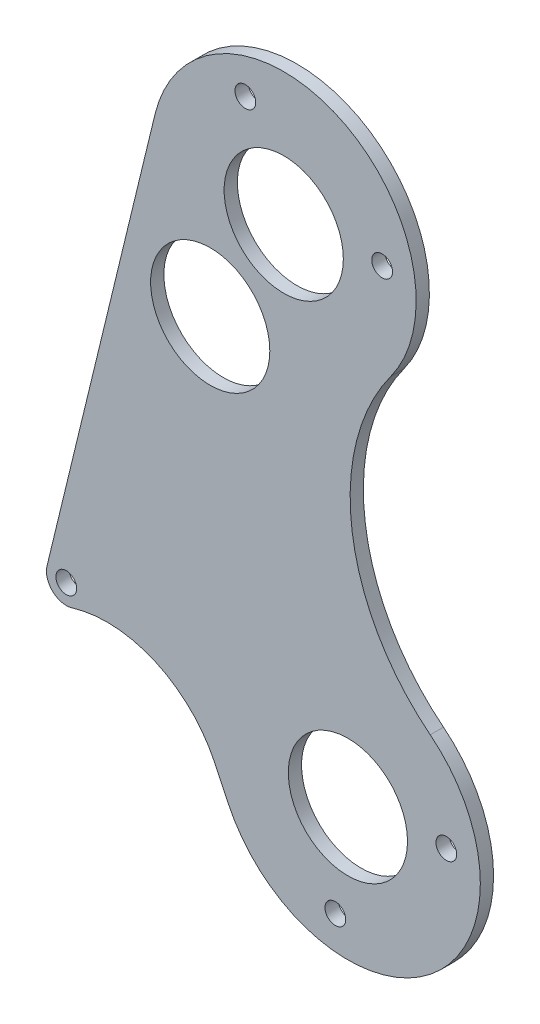
ISO-10303-21;
HEADER;
FILE_DESCRIPTION(('STEP AP214'),'2;1');
FILE_NAME('part.step','',(''),(''),'','','');
FILE_SCHEMA(('AUTOMOTIVE_DESIGN { 1 0 10303 214 1 1 1 1 }'));
ENDSEC;
DATA;
#1=APPLICATION_CONTEXT('core data for automotive mechanical design processes');
#2=APPLICATION_PROTOCOL_DEFINITION('international standard','automotive_design',2000,#1);
#3=PRODUCT_CONTEXT('',#1,'mechanical');
#4=PRODUCT('Part','Part','',(#3));
#5=PRODUCT_RELATED_PRODUCT_CATEGORY('part','',(#4));
#6=PRODUCT_DEFINITION_FORMATION('','',#4);
#7=PRODUCT_DEFINITION_CONTEXT('part definition',#1,'design');
#8=PRODUCT_DEFINITION('design','',#6,#7);
#9=PRODUCT_DEFINITION_SHAPE('','',#8);
#10=(LENGTH_UNIT() NAMED_UNIT(*) SI_UNIT(.MILLI.,.METRE.));
#11=(NAMED_UNIT(*) PLANE_ANGLE_UNIT() SI_UNIT($,.RADIAN.));
#12=(NAMED_UNIT(*) SI_UNIT($,.STERADIAN.) SOLID_ANGLE_UNIT());
#13=UNCERTAINTY_MEASURE_WITH_UNIT(LENGTH_MEASURE(1.E-05),#10,'distance_accuracy_value','');
#14=(GEOMETRIC_REPRESENTATION_CONTEXT(3) GLOBAL_UNCERTAINTY_ASSIGNED_CONTEXT((#13)) GLOBAL_UNIT_ASSIGNED_CONTEXT((#10,
#11,#12)) REPRESENTATION_CONTEXT('',''));
#15=CARTESIAN_POINT('',(0.,0.,0.));
#16=DIRECTION('',(0.,0.,1.));
#17=DIRECTION('',(1.,0.,0.));
#18=AXIS2_PLACEMENT_3D('',#15,#16,#17);
#19=CARTESIAN_POINT('',(705.932956494156,300.505165485995,1.5875));
#20=DIRECTION('',(0.,0.,1.));
#21=DIRECTION('',(1.,0.,0.));
#22=AXIS2_PLACEMENT_3D('',#19,#20,#21);
#23=PLANE('',#22);
#24=CARTESIAN_POINT('',(587.084023474299,248.692957946112,1.5875));
#25=DIRECTION('',(0.,0.,1.));
#26=DIRECTION('',(1.,0.,0.));
#27=AXIS2_PLACEMENT_3D('',#24,#25,#26);
#28=CIRCLE('',#27,2.48920000000018);
#29=CARTESIAN_POINT('',(589.5732234743,248.692957946112,1.5875));
#30=VERTEX_POINT('',#29);
#31=EDGE_CURVE('E198',#30,#30,#28,.T.);
#32=ORIENTED_EDGE('',*,*,#31,.F.);
#33=EDGE_LOOP('',(#32));
#34=FACE_BOUND('',#33,.T.);
#35=CARTESIAN_POINT('',(639.214570258484,349.117503818025,1.5875));
#36=DIRECTION('',(0.,0.,1.));
#37=DIRECTION('',(1.,0.,0.));
#38=AXIS2_PLACEMENT_3D('',#35,#36,#37);
#39=CIRCLE('',#38,14.2875);
#40=CARTESIAN_POINT('',(653.502070258484,349.117503818025,1.5875));
#41=VERTEX_POINT('',#40);
#42=EDGE_CURVE('E186',#41,#41,#39,.T.);
#43=ORIENTED_EDGE('',*,*,#42,.F.);
#44=EDGE_LOOP('',(#43));
#45=FACE_BOUND('',#44,.T.);
#46=CARTESIAN_POINT('',(662.810390943274,352.322562703799,1.5875));
#47=DIRECTION('',(0.,0.,1.));
#48=DIRECTION('',(1.,0.,0.));
#49=AXIS2_PLACEMENT_3D('',#46,#47,#48);
#50=CIRCLE('',#49,2.48919999999995);
#51=CARTESIAN_POINT('',(665.299590943274,352.322562703799,1.5875));
#52=VERTEX_POINT('',#51);
#53=EDGE_CURVE('E174',#52,#52,#50,.T.);
#54=ORIENTED_EDGE('',*,*,#53,.F.);
#55=EDGE_LOOP('',(#54));
#56=FACE_BOUND('',#55,.T.);
#57=CARTESIAN_POINT('',(678.194673594987,239.062623416811,1.5875));
#58=DIRECTION('',(0.,0.,1.));
#59=DIRECTION('',(1.,0.,0.));
#60=AXIS2_PLACEMENT_3D('',#57,#58,#59);
#61=CIRCLE('',#60,2.48919999999995);
#62=CARTESIAN_POINT('',(680.683873594987,239.062623416811,1.5875));
#63=VERTEX_POINT('',#62);
#64=EDGE_CURVE('E132',#63,#63,#61,.T.);
#65=ORIENTED_EDGE('',*,*,#64,.F.);
#66=EDGE_LOOP('',(#65));
#67=FACE_BOUND('',#66,.T.);
#68=CARTESIAN_POINT('',(705.932956494156,300.505165485995,1.5875));
#69=DIRECTION('',(0.,0.,-1.));
#70=DIRECTION('',(1.,0.,0.));
#71=AXIS2_PLACEMENT_3D('',#68,#69,#70);
#72=CIRCLE('',#71,50.8);
#73=CARTESIAN_POINT('',(674.342738904028,260.72202643679,1.5875));
#74=VERTEX_POINT('',#73);
#75=CARTESIAN_POINT('',(664.875488041435,330.420450613398,1.5875));
#76=VERTEX_POINT('',#75);
#77=EDGE_CURVE('E141',#74,#76,#72,.T.);
#78=ORIENTED_EDGE('',*,*,#77,.T.);
#79=CARTESIAN_POINT('',(639.214570258484,349.117503818025,1.5875));
#80=DIRECTION('',(0.,0.,1.));
#81=DIRECTION('',(-1.,0.,0.));
#82=AXIS2_PLACEMENT_3D('',#79,#80,#81);
#83=CIRCLE('',#82,31.75);
#84=CARTESIAN_POINT('',(608.35938841906,356.602171723553,1.5875));
#85=VERTEX_POINT('',#84);
#86=EDGE_CURVE('E94',#76,#85,#83,.T.);
#87=ORIENTED_EDGE('',*,*,#86,.T.);
#88=DIRECTION('',(-0.235737571827634,-0.971816750848024,0.));
#89=VECTOR('',#88,1.);
#90=CARTESIAN_POINT('',(582.455746198386,249.815658131941,1.5875));
#91=LINE('',#90,#89);
#92=CARTESIAN_POINT('',(582.455746198386,249.815658131941,1.5875));
#93=VERTEX_POINT('',#92);
#94=EDGE_CURVE('E153',#85,#93,#91,.T.);
#95=ORIENTED_EDGE('',*,*,#94,.T.);
#96=CARTESIAN_POINT('',(587.084023474299,248.692957946112,1.5875));
#97=DIRECTION('',(0.,0.,1.));
#98=DIRECTION('',(1.,0.,0.));
#99=AXIS2_PLACEMENT_3D('',#96,#97,#98);
#100=CIRCLE('',#99,4.76250000000006);
#101=CARTESIAN_POINT('',(588.479947674082,244.139629286938,1.5875));
#102=VERTEX_POINT('',#101);
#103=EDGE_CURVE('E110',#93,#102,#100,.T.);
#104=ORIENTED_EDGE('',*,*,#103,.T.);
#105=CARTESIAN_POINT('',(596.855492872776,216.819657331889,1.5875));
#106=DIRECTION('',(0.,0.,-1.));
#107=DIRECTION('',(1.,0.,0.));
#108=AXIS2_PLACEMENT_3D('',#105,#106,#107);
#109=CIRCLE('',#108,28.575);
#110=CARTESIAN_POINT('',(622.664025284348,229.085474865215,1.5875));
#111=VERTEX_POINT('',#110);
#112=EDGE_CURVE('E104',#102,#111,#109,.T.);
#113=ORIENTED_EDGE('',*,*,#112,.T.);
#114=DIRECTION('',(0.429249957421718,-0.903185736187996,0.));
#115=VECTOR('',#114,1.);
#116=CARTESIAN_POINT('',(625.922705786229,222.228878382898,1.5875));
#117=LINE('',#116,#115);
#118=CARTESIAN_POINT('',(625.922705786229,222.228878382898,1.5875));
#119=VERTEX_POINT('',#118);
#120=EDGE_CURVE('E108',#111,#119,#117,.T.);
#121=ORIENTED_EDGE('',*,*,#120,.T.);
#122=CARTESIAN_POINT('',(654.598852910197,235.857564531037,1.5875));
#123=DIRECTION('',(0.,0.,1.));
#124=DIRECTION('',(-1.,0.,0.));
#125=AXIS2_PLACEMENT_3D('',#122,#123,#124);
#126=CIRCLE('',#125,31.75);
#127=EDGE_CURVE('E54',#119,#74,#126,.T.);
#128=ORIENTED_EDGE('',*,*,#127,.T.);
#129=EDGE_LOOP('',(#78,#87,#95,#104,#113,#121,#128));
#130=FACE_BOUND('',#129,.T.);
#131=CARTESIAN_POINT('',(651.587654284696,212.2362216588,1.5875));
#132=DIRECTION('',(0.,0.,1.));
#133=DIRECTION('',(1.,0.,0.));
#134=AXIS2_PLACEMENT_3D('',#131,#132,#133);
#135=CIRCLE('',#134,2.48920000000041);
#136=CARTESIAN_POINT('',(654.076854284697,212.2362216588,1.5875));
#137=VERTEX_POINT('',#136);
#138=EDGE_CURVE('E168',#137,#137,#135,.T.);
#139=ORIENTED_EDGE('',*,*,#138,.F.);
#140=EDGE_LOOP('',(#139));
#141=FACE_BOUND('',#140,.T.);
#142=CARTESIAN_POINT('',(630.011673327891,371.079786129636,1.5875));
#143=DIRECTION('',(0.,0.,1.));
#144=DIRECTION('',(1.,0.,0.));
#145=AXIS2_PLACEMENT_3D('',#142,#143,#144);
#146=CIRCLE('',#145,2.48919999999995);
#147=CARTESIAN_POINT('',(632.500873327891,371.079786129636,1.5875));
#148=VERTEX_POINT('',#147);
#149=EDGE_CURVE('E180',#148,#148,#146,.T.);
#150=ORIENTED_EDGE('',*,*,#149,.F.);
#151=EDGE_LOOP('',(#150));
#152=FACE_BOUND('',#151,.T.);
#153=CARTESIAN_POINT('',(654.598852910197,235.857564531037,1.5875));
#154=DIRECTION('',(0.,0.,1.));
#155=DIRECTION('',(1.,0.,0.));
#156=AXIS2_PLACEMENT_3D('',#153,#154,#155);
#157=CIRCLE('',#156,14.2875);
#158=CARTESIAN_POINT('',(668.886352910198,235.857564531037,1.5875));
#159=VERTEX_POINT('',#158);
#160=EDGE_CURVE('E192',#159,#159,#157,.T.);
#161=ORIENTED_EDGE('',*,*,#160,.F.);
#162=EDGE_LOOP('',(#161));
#163=FACE_BOUND('',#162,.T.);
#164=CARTESIAN_POINT('',(621.587403634769,321.196124969197,1.5875));
#165=DIRECTION('',(0.,0.,1.));
#166=DIRECTION('',(1.,0.,0.));
#167=AXIS2_PLACEMENT_3D('',#164,#165,#166);
#168=CIRCLE('',#167,14.2875);
#169=CARTESIAN_POINT('',(635.874903634769,321.196124969197,1.5875));
#170=VERTEX_POINT('',#169);
#171=EDGE_CURVE('E204',#170,#170,#168,.T.);
#172=ORIENTED_EDGE('',*,*,#171,.F.);
#173=EDGE_LOOP('',(#172));
#174=FACE_BOUND('',#173,.T.);
#175=ADVANCED_FACE('F37',(#34,#45,#56,#67,#130,#141,#152,#163,#174),#23,.T.);
#176=CARTESIAN_POINT('',(705.932956494156,300.505165485995,-1.5875));
#177=DIRECTION('',(0.,0.,1.));
#178=DIRECTION('',(1.,0.,0.));
#179=AXIS2_PLACEMENT_3D('',#176,#177,#178);
#180=PLANE('',#179);
#181=CARTESIAN_POINT('',(705.932956494156,300.505165485995,-1.5875));
#182=DIRECTION('',(0.,0.,-1.));
#183=DIRECTION('',(1.,0.,0.));
#184=AXIS2_PLACEMENT_3D('',#181,#182,#183);
#185=CIRCLE('',#184,50.8);
#186=CARTESIAN_POINT('',(674.342738904028,260.72202643679,-1.5875));
#187=VERTEX_POINT('',#186);
#188=CARTESIAN_POINT('',(664.875488041435,330.420450613398,-1.5875));
#189=VERTEX_POINT('',#188);
#190=EDGE_CURVE('E128',#187,#189,#185,.T.);
#191=ORIENTED_EDGE('',*,*,#190,.F.);
#192=CARTESIAN_POINT('',(654.598852910197,235.857564531037,-1.5875));
#193=DIRECTION('',(0.,0.,1.));
#194=DIRECTION('',(-1.,0.,0.));
#195=AXIS2_PLACEMENT_3D('',#192,#193,#194);
#196=CIRCLE('',#195,31.75);
#197=CARTESIAN_POINT('',(625.922705786229,222.228878382898,-1.5875));
#198=VERTEX_POINT('',#197);
#199=EDGE_CURVE('E86',#198,#187,#196,.T.);
#200=ORIENTED_EDGE('',*,*,#199,.F.);
#201=DIRECTION('',(0.429249957421718,-0.903185736187996,0.));
#202=VECTOR('',#201,1.);
#203=CARTESIAN_POINT('',(625.922705786229,222.228878382898,-1.5875));
#204=LINE('',#203,#202);
#205=CARTESIAN_POINT('',(622.664025284348,229.085474865215,-1.5875));
#206=VERTEX_POINT('',#205);
#207=EDGE_CURVE('E80',#206,#198,#204,.T.);
#208=ORIENTED_EDGE('',*,*,#207,.F.);
#209=CARTESIAN_POINT('',(596.855492872776,216.819657331889,-1.5875));
#210=DIRECTION('',(0.,0.,-1.));
#211=DIRECTION('',(1.,0.,0.));
#212=AXIS2_PLACEMENT_3D('',#209,#210,#211);
#213=CIRCLE('',#212,28.575);
#214=CARTESIAN_POINT('',(588.479947674082,244.139629286938,-1.5875));
#215=VERTEX_POINT('',#214);
#216=EDGE_CURVE('E118',#215,#206,#213,.T.);
#217=ORIENTED_EDGE('',*,*,#216,.F.);
#218=CARTESIAN_POINT('',(587.084023474299,248.692957946112,-1.5875));
#219=DIRECTION('',(0.,0.,1.));
#220=DIRECTION('',(1.,0.,0.));
#221=AXIS2_PLACEMENT_3D('',#218,#219,#220);
#222=CIRCLE('',#221,4.76250000000006);
#223=CARTESIAN_POINT('',(582.455746198386,249.815658131941,-1.5875));
#224=VERTEX_POINT('',#223);
#225=EDGE_CURVE('E136',#224,#215,#222,.T.);
#226=ORIENTED_EDGE('',*,*,#225,.F.);
#227=DIRECTION('',(-0.235737571827634,-0.971816750848024,0.));
#228=VECTOR('',#227,1.);
#229=CARTESIAN_POINT('',(582.455746198386,249.815658131941,-1.5875));
#230=LINE('',#229,#228);
#231=CARTESIAN_POINT('',(608.35938841906,356.602171723553,-1.5875));
#232=VERTEX_POINT('',#231);
#233=EDGE_CURVE('E134',#232,#224,#230,.T.);
#234=ORIENTED_EDGE('',*,*,#233,.F.);
#235=CARTESIAN_POINT('',(639.214570258484,349.117503818025,-1.5875));
#236=DIRECTION('',(0.,0.,1.));
#237=DIRECTION('',(-1.,0.,0.));
#238=AXIS2_PLACEMENT_3D('',#235,#236,#237);
#239=CIRCLE('',#238,31.75);
#240=EDGE_CURVE('E131',#189,#232,#239,.T.);
#241=ORIENTED_EDGE('',*,*,#240,.F.);
#242=EDGE_LOOP('',(#191,#200,#208,#217,#226,#234,#241));
#243=FACE_BOUND('',#242,.T.);
#244=CARTESIAN_POINT('',(678.194673594987,239.062623416811,-1.5875));
#245=DIRECTION('',(0.,0.,1.));
#246=DIRECTION('',(1.,0.,0.));
#247=AXIS2_PLACEMENT_3D('',#244,#245,#246);
#248=CIRCLE('',#247,2.48919999999995);
#249=CARTESIAN_POINT('',(680.683873594987,239.062623416811,-1.5875));
#250=VERTEX_POINT('',#249);
#251=EDGE_CURVE('E165',#250,#250,#248,.T.);
#252=ORIENTED_EDGE('',*,*,#251,.T.);
#253=EDGE_LOOP('',(#252));
#254=FACE_BOUND('',#253,.T.);
#255=CARTESIAN_POINT('',(651.587654284696,212.2362216588,-1.5875));
#256=DIRECTION('',(0.,0.,1.));
#257=DIRECTION('',(1.,0.,0.));
#258=AXIS2_PLACEMENT_3D('',#255,#256,#257);
#259=CIRCLE('',#258,2.48920000000041);
#260=CARTESIAN_POINT('',(654.076854284697,212.2362216588,-1.5875));
#261=VERTEX_POINT('',#260);
#262=EDGE_CURVE('E171',#261,#261,#259,.T.);
#263=ORIENTED_EDGE('',*,*,#262,.T.);
#264=EDGE_LOOP('',(#263));
#265=FACE_BOUND('',#264,.T.);
#266=CARTESIAN_POINT('',(662.810390943274,352.322562703799,-1.5875));
#267=DIRECTION('',(0.,0.,1.));
#268=DIRECTION('',(1.,0.,0.));
#269=AXIS2_PLACEMENT_3D('',#266,#267,#268);
#270=CIRCLE('',#269,2.48919999999995);
#271=CARTESIAN_POINT('',(665.299590943274,352.322562703799,-1.5875));
#272=VERTEX_POINT('',#271);
#273=EDGE_CURVE('E177',#272,#272,#270,.T.);
#274=ORIENTED_EDGE('',*,*,#273,.T.);
#275=EDGE_LOOP('',(#274));
#276=FACE_BOUND('',#275,.T.);
#277=CARTESIAN_POINT('',(630.011673327891,371.079786129636,-1.5875));
#278=DIRECTION('',(0.,0.,1.));
#279=DIRECTION('',(1.,0.,0.));
#280=AXIS2_PLACEMENT_3D('',#277,#278,#279);
#281=CIRCLE('',#280,2.48919999999995);
#282=CARTESIAN_POINT('',(632.500873327891,371.079786129636,-1.5875));
#283=VERTEX_POINT('',#282);
#284=EDGE_CURVE('E183',#283,#283,#281,.T.);
#285=ORIENTED_EDGE('',*,*,#284,.T.);
#286=EDGE_LOOP('',(#285));
#287=FACE_BOUND('',#286,.T.);
#288=CARTESIAN_POINT('',(639.214570258484,349.117503818025,-1.5875));
#289=DIRECTION('',(0.,0.,1.));
#290=DIRECTION('',(1.,0.,0.));
#291=AXIS2_PLACEMENT_3D('',#288,#289,#290);
#292=CIRCLE('',#291,14.2875);
#293=CARTESIAN_POINT('',(653.502070258484,349.117503818025,-1.5875));
#294=VERTEX_POINT('',#293);
#295=EDGE_CURVE('E189',#294,#294,#292,.T.);
#296=ORIENTED_EDGE('',*,*,#295,.T.);
#297=EDGE_LOOP('',(#296));
#298=FACE_BOUND('',#297,.T.);
#299=CARTESIAN_POINT('',(654.598852910197,235.857564531037,-1.5875));
#300=DIRECTION('',(0.,0.,1.));
#301=DIRECTION('',(1.,0.,0.));
#302=AXIS2_PLACEMENT_3D('',#299,#300,#301);
#303=CIRCLE('',#302,14.2875);
#304=CARTESIAN_POINT('',(668.886352910198,235.857564531037,-1.5875));
#305=VERTEX_POINT('',#304);
#306=EDGE_CURVE('E195',#305,#305,#303,.T.);
#307=ORIENTED_EDGE('',*,*,#306,.T.);
#308=EDGE_LOOP('',(#307));
#309=FACE_BOUND('',#308,.T.);
#310=CARTESIAN_POINT('',(587.084023474299,248.692957946112,-1.5875));
#311=DIRECTION('',(0.,0.,1.));
#312=DIRECTION('',(1.,0.,0.));
#313=AXIS2_PLACEMENT_3D('',#310,#311,#312);
#314=CIRCLE('',#313,2.48920000000018);
#315=CARTESIAN_POINT('',(589.5732234743,248.692957946112,-1.5875));
#316=VERTEX_POINT('',#315);
#317=EDGE_CURVE('E201',#316,#316,#314,.T.);
#318=ORIENTED_EDGE('',*,*,#317,.T.);
#319=EDGE_LOOP('',(#318));
#320=FACE_BOUND('',#319,.T.);
#321=CARTESIAN_POINT('',(621.587403634769,321.196124969197,-1.5875));
#322=DIRECTION('',(0.,0.,1.));
#323=DIRECTION('',(1.,0.,0.));
#324=AXIS2_PLACEMENT_3D('',#321,#322,#323);
#325=CIRCLE('',#324,14.2875);
#326=CARTESIAN_POINT('',(635.874903634769,321.196124969197,-1.5875));
#327=VERTEX_POINT('',#326);
#328=EDGE_CURVE('E207',#327,#327,#325,.T.);
#329=ORIENTED_EDGE('',*,*,#328,.T.);
#330=EDGE_LOOP('',(#329));
#331=FACE_BOUND('',#330,.T.);
#332=ADVANCED_FACE('F157',(#243,#254,#265,#276,#287,#298,#309,#320,#331),#180,.F.);
#333=CARTESIAN_POINT('',(705.932956494156,300.505165485995,1.5875));
#334=DIRECTION('',(0.,0.,-1.));
#335=DIRECTION('',(-1.,0.,0.));
#336=AXIS2_PLACEMENT_3D('',#333,#334,#335);
#337=CYLINDRICAL_SURFACE('',#336,50.8);
#338=ORIENTED_EDGE('',*,*,#190,.T.);
#339=DIRECTION('',(0.,0.,-1.));
#340=VECTOR('',#339,1.);
#341=CARTESIAN_POINT('',(664.875488041435,330.420450613398,1.5875));
#342=LINE('',#341,#340);
#343=EDGE_CURVE('E11',#76,#189,#342,.T.);
#344=ORIENTED_EDGE('',*,*,#343,.F.);
#345=ORIENTED_EDGE('',*,*,#77,.F.);
#346=DIRECTION('',(0.,0.,-1.));
#347=VECTOR('',#346,1.);
#348=CARTESIAN_POINT('',(674.342738904028,260.72202643679,1.5875));
#349=LINE('',#348,#347);
#350=EDGE_CURVE('E124',#74,#187,#349,.T.);
#351=ORIENTED_EDGE('',*,*,#350,.T.);
#352=EDGE_LOOP('',(#338,#344,#345,#351));
#353=FACE_BOUND('',#352,.T.);
#354=ADVANCED_FACE('F39',(#353),#337,.F.);
#355=CARTESIAN_POINT('',(639.214570258484,349.117503818025,1.5875));
#356=DIRECTION('',(0.,0.,-1.));
#357=DIRECTION('',(-1.,0.,0.));
#358=AXIS2_PLACEMENT_3D('',#355,#356,#357);
#359=CYLINDRICAL_SURFACE('',#358,31.75);
#360=ORIENTED_EDGE('',*,*,#240,.T.);
#361=DIRECTION('',(0.,0.,-1.));
#362=VECTOR('',#361,1.);
#363=CARTESIAN_POINT('',(608.35938841906,356.602171723553,1.5875));
#364=LINE('',#363,#362);
#365=EDGE_CURVE('E46',#85,#232,#364,.T.);
#366=ORIENTED_EDGE('',*,*,#365,.F.);
#367=ORIENTED_EDGE('',*,*,#86,.F.);
#368=ORIENTED_EDGE('',*,*,#343,.T.);
#369=EDGE_LOOP('',(#360,#366,#367,#368));
#370=FACE_BOUND('',#369,.T.);
#371=ADVANCED_FACE('F239',(#370),#359,.T.);
#372=CARTESIAN_POINT('',(582.455746198386,249.815658131941,1.5875));
#373=DIRECTION('',(0.971816750848024,-0.235737571827634,0.));
#374=DIRECTION('',(0.235737571827634,0.971816750848024,0.));
#375=AXIS2_PLACEMENT_3D('',#372,#373,#374);
#376=PLANE('',#375);
#377=ORIENTED_EDGE('',*,*,#233,.T.);
#378=DIRECTION('',(0.,0.,-1.));
#379=VECTOR('',#378,1.);
#380=CARTESIAN_POINT('',(582.455746198386,249.815658131941,1.5875));
#381=LINE('',#380,#379);
#382=EDGE_CURVE('E145',#93,#224,#381,.T.);
#383=ORIENTED_EDGE('',*,*,#382,.F.);
#384=ORIENTED_EDGE('',*,*,#94,.F.);
#385=ORIENTED_EDGE('',*,*,#365,.T.);
#386=EDGE_LOOP('',(#377,#383,#384,#385));
#387=FACE_BOUND('',#386,.T.);
#388=ADVANCED_FACE('F151',(#387),#376,.F.);
#389=CARTESIAN_POINT('',(587.084023474299,248.692957946112,1.5875));
#390=DIRECTION('',(0.,0.,-1.));
#391=DIRECTION('',(-1.,0.,0.));
#392=AXIS2_PLACEMENT_3D('',#389,#390,#391);
#393=CYLINDRICAL_SURFACE('',#392,4.76250000000006);
#394=ORIENTED_EDGE('',*,*,#225,.T.);
#395=DIRECTION('',(0.,0.,-1.));
#396=VECTOR('',#395,1.);
#397=CARTESIAN_POINT('',(588.479947674082,244.139629286938,1.5875));
#398=LINE('',#397,#396);
#399=EDGE_CURVE('E119',#102,#215,#398,.T.);
#400=ORIENTED_EDGE('',*,*,#399,.F.);
#401=ORIENTED_EDGE('',*,*,#103,.F.);
#402=ORIENTED_EDGE('',*,*,#382,.T.);
#403=EDGE_LOOP('',(#394,#400,#401,#402));
#404=FACE_BOUND('',#403,.T.);
#405=ADVANCED_FACE('F160',(#404),#393,.T.);
#406=CARTESIAN_POINT('',(596.855492872776,216.819657331889,1.5875));
#407=DIRECTION('',(0.,0.,-1.));
#408=DIRECTION('',(-1.,0.,0.));
#409=AXIS2_PLACEMENT_3D('',#406,#407,#408);
#410=CYLINDRICAL_SURFACE('',#409,28.575);
#411=ORIENTED_EDGE('',*,*,#216,.T.);
#412=DIRECTION('',(0.,0.,-1.));
#413=VECTOR('',#412,1.);
#414=CARTESIAN_POINT('',(622.664025284348,229.085474865215,1.5875));
#415=LINE('',#414,#413);
#416=EDGE_CURVE('E115',#111,#206,#415,.T.);
#417=ORIENTED_EDGE('',*,*,#416,.F.);
#418=ORIENTED_EDGE('',*,*,#112,.F.);
#419=ORIENTED_EDGE('',*,*,#399,.T.);
#420=EDGE_LOOP('',(#411,#417,#418,#419));
#421=FACE_BOUND('',#420,.T.);
#422=ADVANCED_FACE('F116',(#421),#410,.F.);
#423=CARTESIAN_POINT('',(625.922705786229,222.228878382898,1.5875));
#424=DIRECTION('',(0.903185736187996,0.429249957421718,0.));
#425=DIRECTION('',(-0.429249957421718,0.903185736187996,0.));
#426=AXIS2_PLACEMENT_3D('',#423,#424,#425);
#427=PLANE('',#426);
#428=ORIENTED_EDGE('',*,*,#207,.T.);
#429=DIRECTION('',(0.,0.,-1.));
#430=VECTOR('',#429,1.);
#431=CARTESIAN_POINT('',(625.922705786229,222.228878382898,1.5875));
#432=LINE('',#431,#430);
#433=EDGE_CURVE('E120',#119,#198,#432,.T.);
#434=ORIENTED_EDGE('',*,*,#433,.F.);
#435=ORIENTED_EDGE('',*,*,#120,.F.);
#436=ORIENTED_EDGE('',*,*,#416,.T.);
#437=EDGE_LOOP('',(#428,#434,#435,#436));
#438=FACE_BOUND('',#437,.T.);
#439=ADVANCED_FACE('F122',(#438),#427,.F.);
#440=CARTESIAN_POINT('',(654.598852910197,235.857564531037,1.5875));
#441=DIRECTION('',(0.,0.,-1.));
#442=DIRECTION('',(-1.,0.,0.));
#443=AXIS2_PLACEMENT_3D('',#440,#441,#442);
#444=CYLINDRICAL_SURFACE('',#443,31.75);
#445=ORIENTED_EDGE('',*,*,#199,.T.);
#446=ORIENTED_EDGE('',*,*,#350,.F.);
#447=ORIENTED_EDGE('',*,*,#127,.F.);
#448=ORIENTED_EDGE('',*,*,#433,.T.);
#449=EDGE_LOOP('',(#445,#446,#447,#448));
#450=FACE_BOUND('',#449,.T.);
#451=ADVANCED_FACE('F229',(#450),#444,.T.);
#452=CARTESIAN_POINT('',(678.194673594987,239.062623416811,1.5875));
#453=DIRECTION('',(0.,0.,-1.));
#454=DIRECTION('',(-1.,0.,0.));
#455=AXIS2_PLACEMENT_3D('',#452,#453,#454);
#456=CYLINDRICAL_SURFACE('',#455,2.48919999999995);
#457=ORIENTED_EDGE('',*,*,#64,.T.);
#458=EDGE_LOOP('',(#457));
#459=FACE_BOUND('',#458,.T.);
#460=ORIENTED_EDGE('',*,*,#251,.F.);
#461=EDGE_LOOP('',(#460));
#462=FACE_BOUND('',#461,.T.);
#463=ADVANCED_FACE('F226',(#459,#462),#456,.F.);
#464=CARTESIAN_POINT('',(651.587654284696,212.2362216588,1.5875));
#465=DIRECTION('',(0.,0.,-1.));
#466=DIRECTION('',(-1.,0.,0.));
#467=AXIS2_PLACEMENT_3D('',#464,#465,#466);
#468=CYLINDRICAL_SURFACE('',#467,2.48920000000041);
#469=ORIENTED_EDGE('',*,*,#138,.T.);
#470=EDGE_LOOP('',(#469));
#471=FACE_BOUND('',#470,.T.);
#472=ORIENTED_EDGE('',*,*,#262,.F.);
#473=EDGE_LOOP('',(#472));
#474=FACE_BOUND('',#473,.T.);
#475=ADVANCED_FACE('F309',(#471,#474),#468,.F.);
#476=CARTESIAN_POINT('',(662.810390943274,352.322562703799,1.5875));
#477=DIRECTION('',(0.,0.,-1.));
#478=DIRECTION('',(-1.,0.,0.));
#479=AXIS2_PLACEMENT_3D('',#476,#477,#478);
#480=CYLINDRICAL_SURFACE('',#479,2.48919999999995);
#481=ORIENTED_EDGE('',*,*,#53,.T.);
#482=EDGE_LOOP('',(#481));
#483=FACE_BOUND('',#482,.T.);
#484=ORIENTED_EDGE('',*,*,#273,.F.);
#485=EDGE_LOOP('',(#484));
#486=FACE_BOUND('',#485,.T.);
#487=ADVANCED_FACE('F318',(#483,#486),#480,.F.);
#488=CARTESIAN_POINT('',(630.011673327891,371.079786129636,1.5875));
#489=DIRECTION('',(0.,0.,-1.));
#490=DIRECTION('',(-1.,0.,0.));
#491=AXIS2_PLACEMENT_3D('',#488,#489,#490);
#492=CYLINDRICAL_SURFACE('',#491,2.48919999999995);
#493=ORIENTED_EDGE('',*,*,#149,.T.);
#494=EDGE_LOOP('',(#493));
#495=FACE_BOUND('',#494,.T.);
#496=ORIENTED_EDGE('',*,*,#284,.F.);
#497=EDGE_LOOP('',(#496));
#498=FACE_BOUND('',#497,.T.);
#499=ADVANCED_FACE('F327',(#495,#498),#492,.F.);
#500=CARTESIAN_POINT('',(639.214570258484,349.117503818025,1.5875));
#501=DIRECTION('',(0.,0.,-1.));
#502=DIRECTION('',(-1.,0.,0.));
#503=AXIS2_PLACEMENT_3D('',#500,#501,#502);
#504=CYLINDRICAL_SURFACE('',#503,14.2875);
#505=ORIENTED_EDGE('',*,*,#42,.T.);
#506=EDGE_LOOP('',(#505));
#507=FACE_BOUND('',#506,.T.);
#508=ORIENTED_EDGE('',*,*,#295,.F.);
#509=EDGE_LOOP('',(#508));
#510=FACE_BOUND('',#509,.T.);
#511=ADVANCED_FACE('F337',(#507,#510),#504,.F.);
#512=CARTESIAN_POINT('',(654.598852910197,235.857564531037,1.5875));
#513=DIRECTION('',(0.,0.,-1.));
#514=DIRECTION('',(-1.,0.,0.));
#515=AXIS2_PLACEMENT_3D('',#512,#513,#514);
#516=CYLINDRICAL_SURFACE('',#515,14.2875);
#517=ORIENTED_EDGE('',*,*,#160,.T.);
#518=EDGE_LOOP('',(#517));
#519=FACE_BOUND('',#518,.T.);
#520=ORIENTED_EDGE('',*,*,#306,.F.);
#521=EDGE_LOOP('',(#520));
#522=FACE_BOUND('',#521,.T.);
#523=ADVANCED_FACE('F347',(#519,#522),#516,.F.);
#524=CARTESIAN_POINT('',(587.084023474299,248.692957946112,1.5875));
#525=DIRECTION('',(0.,0.,-1.));
#526=DIRECTION('',(-1.,0.,0.));
#527=AXIS2_PLACEMENT_3D('',#524,#525,#526);
#528=CYLINDRICAL_SURFACE('',#527,2.48920000000018);
#529=ORIENTED_EDGE('',*,*,#31,.T.);
#530=EDGE_LOOP('',(#529));
#531=FACE_BOUND('',#530,.T.);
#532=ORIENTED_EDGE('',*,*,#317,.F.);
#533=EDGE_LOOP('',(#532));
#534=FACE_BOUND('',#533,.T.);
#535=ADVANCED_FACE('F357',(#531,#534),#528,.F.);
#536=CARTESIAN_POINT('',(621.587403634769,321.196124969197,1.5875));
#537=DIRECTION('',(0.,0.,-1.));
#538=DIRECTION('',(-1.,0.,0.));
#539=AXIS2_PLACEMENT_3D('',#536,#537,#538);
#540=CYLINDRICAL_SURFACE('',#539,14.2875);
#541=ORIENTED_EDGE('',*,*,#171,.T.);
#542=EDGE_LOOP('',(#541));
#543=FACE_BOUND('',#542,.T.);
#544=ORIENTED_EDGE('',*,*,#328,.F.);
#545=EDGE_LOOP('',(#544));
#546=FACE_BOUND('',#545,.T.);
#547=ADVANCED_FACE('F213',(#543,#546),#540,.F.);
#548=CLOSED_SHELL('',(#175,#332,#354,#371,#388,#405,#422,#439,#451,#463,#475,#487,#499,#511,
#523,#535,#547));
#549=MANIFOLD_SOLID_BREP('B2',#548);
#550=ADVANCED_BREP_SHAPE_REPRESENTATION('',(#18,#549),#14);
#551=SHAPE_DEFINITION_REPRESENTATION(#9,#550);
ENDSEC;
END-ISO-10303-21;
